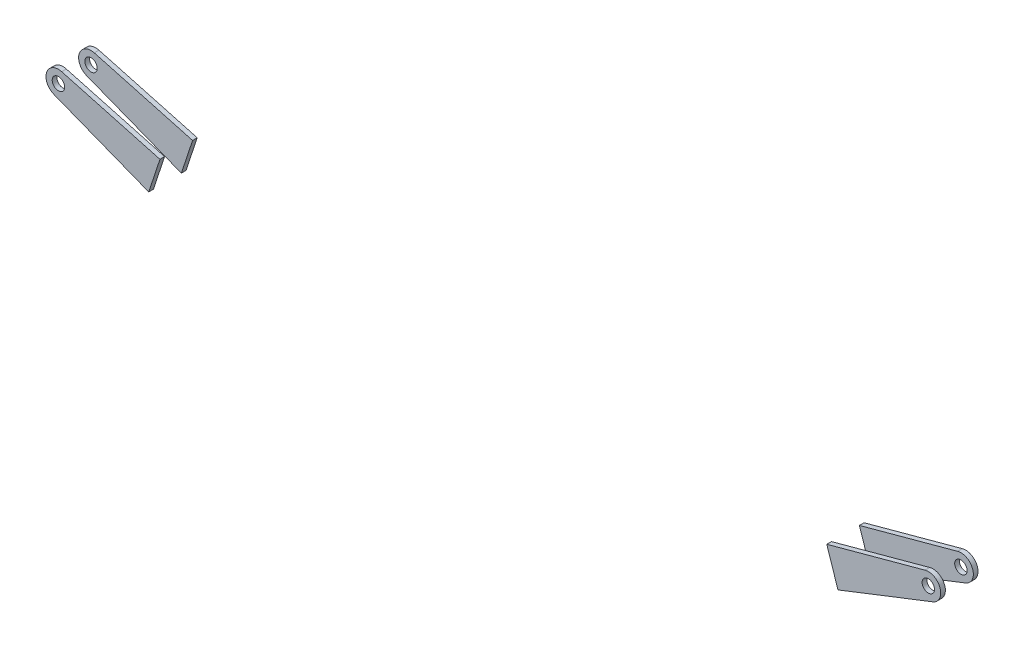
ISO-10303-21;
HEADER;
FILE_DESCRIPTION(('STEP AP214'),'2;1');
FILE_NAME('part.step','',(''),(''),'','','');
FILE_SCHEMA(('AUTOMOTIVE_DESIGN { 1 0 10303 214 1 1 1 1 }'));
ENDSEC;
DATA;
#1=APPLICATION_CONTEXT('core data for automotive mechanical design processes');
#2=APPLICATION_PROTOCOL_DEFINITION('international standard','automotive_design',2000,#1);
#3=PRODUCT_CONTEXT('',#1,'mechanical');
#4=PRODUCT('Part','Part','',(#3));
#5=PRODUCT_RELATED_PRODUCT_CATEGORY('part','',(#4));
#6=PRODUCT_DEFINITION_FORMATION('','',#4);
#7=PRODUCT_DEFINITION_CONTEXT('part definition',#1,'design');
#8=PRODUCT_DEFINITION('design','',#6,#7);
#9=PRODUCT_DEFINITION_SHAPE('','',#8);
#10=(LENGTH_UNIT() NAMED_UNIT(*) SI_UNIT(.MILLI.,.METRE.));
#11=(NAMED_UNIT(*) PLANE_ANGLE_UNIT() SI_UNIT($,.RADIAN.));
#12=(NAMED_UNIT(*) SI_UNIT($,.STERADIAN.) SOLID_ANGLE_UNIT());
#13=UNCERTAINTY_MEASURE_WITH_UNIT(LENGTH_MEASURE(1.E-05),#10,'distance_accuracy_value','');
#14=(GEOMETRIC_REPRESENTATION_CONTEXT(3) GLOBAL_UNCERTAINTY_ASSIGNED_CONTEXT((#13)) GLOBAL_UNIT_ASSIGNED_CONTEXT((#10,
#11,#12)) REPRESENTATION_CONTEXT('',''));
#15=CARTESIAN_POINT('',(0.,0.,0.));
#16=DIRECTION('',(0.,0.,1.));
#17=DIRECTION('',(1.,0.,0.));
#18=AXIS2_PLACEMENT_3D('',#15,#16,#17);
#19=CARTESIAN_POINT('',(0.,-3.14662974701436E-13,258.999999999998));
#20=DIRECTION('',(0.,0.,1.));
#21=DIRECTION('',(1.,0.,0.));
#22=AXIS2_PLACEMENT_3D('',#19,#20,#21);
#23=PLANE('',#22);
#24=CARTESIAN_POINT('',(-280.,-2230.,259.000000000058));
#25=DIRECTION('',(0.,0.,-1.));
#26=DIRECTION('',(-1.,0.,0.));
#27=AXIS2_PLACEMENT_3D('',#24,#25,#26);
#28=CIRCLE('',#27,3.99999999999999);
#29=CARTESIAN_POINT('',(-284.,-2230.,259.000000000058));
#30=VERTEX_POINT('',#29);
#31=EDGE_CURVE('E144',#30,#30,#28,.T.);
#32=ORIENTED_EDGE('',*,*,#31,.F.);
#33=EDGE_LOOP('',(#32));
#34=FACE_BOUND('',#33,.T.);
#35=CARTESIAN_POINT('',(-280.,-2230.,259.000000000058));
#36=DIRECTION('',(0.,0.,-1.));
#37=DIRECTION('',(-1.,0.,0.));
#38=AXIS2_PLACEMENT_3D('',#35,#36,#37);
#39=CIRCLE('',#38,7.9999999999999);
#40=CARTESIAN_POINT('',(-282.91256968066,-2237.45096892057,259.000000000058));
#41=VERTEX_POINT('',#40);
#42=CARTESIAN_POINT('',(-277.901209765393,-2222.28021505798,259.000000000058));
#43=VERTEX_POINT('',#42);
#44=EDGE_CURVE('E134',#41,#43,#39,.T.);
#45=ORIENTED_EDGE('',*,*,#44,.T.);
#46=DIRECTION('',(-0.964973117753147,0.262348779325866,0.));
#47=VECTOR('',#46,1.);
#48=CARTESIAN_POINT('',(-214.641037089507,-2239.47885901617,259.000000000058));
#49=LINE('',#48,#47);
#50=CARTESIAN_POINT('',(-214.641037089507,-2239.47885901617,259.000000000058));
#51=VERTEX_POINT('',#50);
#52=EDGE_CURVE('E164',#51,#43,#49,.T.);
#53=ORIENTED_EDGE('',*,*,#52,.F.);
#54=DIRECTION('',(0.313660285067586,0.949535268208254,0.));
#55=VECTOR('',#54,1.);
#56=CARTESIAN_POINT('',(-221.855223646063,-2261.31817018496,259.000000000059));
#57=LINE('',#56,#55);
#58=CARTESIAN_POINT('',(-221.855223646063,-2261.31817018496,259.000000000059));
#59=VERTEX_POINT('',#58);
#60=EDGE_CURVE('E140',#59,#51,#57,.T.);
#61=ORIENTED_EDGE('',*,*,#60,.F.);
#62=DIRECTION('',(0.931371115071232,-0.364071210082547,0.));
#63=VECTOR('',#62,1.);
#64=CARTESIAN_POINT('',(-282.91256968066,-2237.45096892057,259.000000000058));
#65=LINE('',#64,#63);
#66=EDGE_CURVE('E96',#41,#59,#65,.T.);
#67=ORIENTED_EDGE('',*,*,#66,.F.);
#68=EDGE_LOOP('',(#45,#53,#61,#67));
#69=FACE_BOUND('',#68,.T.);
#70=ADVANCED_FACE('F87',(#34,#69),#23,.F.);
#71=CARTESIAN_POINT('',(0.,-2.35997231026075E-13,261.999999999998));
#72=DIRECTION('',(0.,0.,1.));
#73=DIRECTION('',(1.,0.,0.));
#74=AXIS2_PLACEMENT_3D('',#71,#72,#73);
#75=PLANE('',#74);
#76=CARTESIAN_POINT('',(-280.,-2230.,262.000000000058));
#77=DIRECTION('',(0.,0.,-1.));
#78=DIRECTION('',(-1.,0.,0.));
#79=AXIS2_PLACEMENT_3D('',#76,#77,#78);
#80=CIRCLE('',#79,3.99999999999999);
#81=CARTESIAN_POINT('',(-284.,-2230.,262.000000000058));
#82=VERTEX_POINT('',#81);
#83=EDGE_CURVE('E147',#82,#82,#80,.T.);
#84=ORIENTED_EDGE('',*,*,#83,.T.);
#85=EDGE_LOOP('',(#84));
#86=FACE_BOUND('',#85,.T.);
#87=CARTESIAN_POINT('',(-280.,-2230.,262.000000000058));
#88=DIRECTION('',(0.,0.,-1.));
#89=DIRECTION('',(-1.,0.,0.));
#90=AXIS2_PLACEMENT_3D('',#87,#88,#89);
#91=CIRCLE('',#90,7.9999999999999);
#92=CARTESIAN_POINT('',(-282.91256968066,-2237.45096892057,262.000000000058));
#93=VERTEX_POINT('',#92);
#94=CARTESIAN_POINT('',(-277.901209765393,-2222.28021505798,262.000000000058));
#95=VERTEX_POINT('',#94);
#96=EDGE_CURVE('E133',#93,#95,#91,.T.);
#97=ORIENTED_EDGE('',*,*,#96,.F.);
#98=DIRECTION('',(0.931371115071232,-0.364071210082547,0.));
#99=VECTOR('',#98,1.);
#100=CARTESIAN_POINT('',(-282.91256968066,-2237.45096892057,262.000000000058));
#101=LINE('',#100,#99);
#102=CARTESIAN_POINT('',(-221.855223646063,-2261.31817018496,262.000000000059));
#103=VERTEX_POINT('',#102);
#104=EDGE_CURVE('E13',#93,#103,#101,.T.);
#105=ORIENTED_EDGE('',*,*,#104,.T.);
#106=DIRECTION('',(0.313660285067586,0.949535268208254,0.));
#107=VECTOR('',#106,1.);
#108=CARTESIAN_POINT('',(-221.855223646063,-2261.31817018496,262.000000000059));
#109=LINE('',#108,#107);
#110=CARTESIAN_POINT('',(-214.641037089507,-2239.47885901617,262.000000000058));
#111=VERTEX_POINT('',#110);
#112=EDGE_CURVE('E141',#103,#111,#109,.T.);
#113=ORIENTED_EDGE('',*,*,#112,.T.);
#114=DIRECTION('',(-0.964973117753147,0.262348779325866,0.));
#115=VECTOR('',#114,1.);
#116=CARTESIAN_POINT('',(-214.641037089507,-2239.47885901617,262.000000000058));
#117=LINE('',#116,#115);
#118=EDGE_CURVE('E155',#111,#95,#117,.T.);
#119=ORIENTED_EDGE('',*,*,#118,.T.);
#120=EDGE_LOOP('',(#97,#105,#113,#119));
#121=FACE_BOUND('',#120,.T.);
#122=ADVANCED_FACE('F185',(#86,#121),#75,.T.);
#123=CARTESIAN_POINT('',(-280.,-2230.,262.000000000058));
#124=DIRECTION('',(0.,0.,-1.));
#125=DIRECTION('',(-1.,0.,0.));
#126=AXIS2_PLACEMENT_3D('',#123,#124,#125);
#127=CYLINDRICAL_SURFACE('',#126,7.9999999999999);
#128=ORIENTED_EDGE('',*,*,#44,.F.);
#129=DIRECTION('',(0.,0.,-1.));
#130=VECTOR('',#129,1.);
#131=CARTESIAN_POINT('',(-282.91256968066,-2237.45096892057,262.000000000058));
#132=LINE('',#131,#130);
#133=EDGE_CURVE('E128',#93,#41,#132,.T.);
#134=ORIENTED_EDGE('',*,*,#133,.F.);
#135=ORIENTED_EDGE('',*,*,#96,.T.);
#136=DIRECTION('',(0.,0.,-1.));
#137=VECTOR('',#136,1.);
#138=CARTESIAN_POINT('',(-277.901209765393,-2222.28021505798,262.000000000058));
#139=LINE('',#138,#137);
#140=EDGE_CURVE('E125',#95,#43,#139,.T.);
#141=ORIENTED_EDGE('',*,*,#140,.T.);
#142=EDGE_LOOP('',(#128,#134,#135,#141));
#143=FACE_BOUND('',#142,.T.);
#144=ADVANCED_FACE('F143',(#143),#127,.T.);
#145=CARTESIAN_POINT('',(-282.91256968066,-2237.45096892057,262.000000000058));
#146=DIRECTION('',(0.364071210082547,0.931371115071232,0.));
#147=DIRECTION('',(0.931371115071232,-0.364071210082547,0.));
#148=AXIS2_PLACEMENT_3D('',#145,#146,#147);
#149=PLANE('',#148);
#150=ORIENTED_EDGE('',*,*,#66,.T.);
#151=DIRECTION('',(0.,0.,-1.));
#152=VECTOR('',#151,1.);
#153=CARTESIAN_POINT('',(-221.855223646063,-2261.31817018496,262.000000000059));
#154=LINE('',#153,#152);
#155=EDGE_CURVE('E105',#103,#59,#154,.T.);
#156=ORIENTED_EDGE('',*,*,#155,.F.);
#157=ORIENTED_EDGE('',*,*,#104,.F.);
#158=ORIENTED_EDGE('',*,*,#133,.T.);
#159=EDGE_LOOP('',(#150,#156,#157,#158));
#160=FACE_BOUND('',#159,.T.);
#161=ADVANCED_FACE('F130',(#160),#149,.F.);
#162=CARTESIAN_POINT('',(-221.855223646063,-2261.31817018496,262.000000000059));
#163=DIRECTION('',(-0.949535268208254,0.313660285067586,0.));
#164=DIRECTION('',(0.313660285067586,0.949535268208254,0.));
#165=AXIS2_PLACEMENT_3D('',#162,#163,#164);
#166=PLANE('',#165);
#167=ORIENTED_EDGE('',*,*,#60,.T.);
#168=DIRECTION('',(0.,0.,-1.));
#169=VECTOR('',#168,1.);
#170=CARTESIAN_POINT('',(-214.641037089507,-2239.47885901617,262.000000000058));
#171=LINE('',#170,#169);
#172=EDGE_CURVE('E160',#111,#51,#171,.T.);
#173=ORIENTED_EDGE('',*,*,#172,.F.);
#174=ORIENTED_EDGE('',*,*,#112,.F.);
#175=ORIENTED_EDGE('',*,*,#155,.T.);
#176=EDGE_LOOP('',(#167,#173,#174,#175));
#177=FACE_BOUND('',#176,.T.);
#178=ADVANCED_FACE('F182',(#177),#166,.F.);
#179=CARTESIAN_POINT('',(-214.641037089507,-2239.47885901617,262.000000000058));
#180=DIRECTION('',(-0.262348779325866,-0.964973117753147,0.));
#181=DIRECTION('',(-0.964973117753147,0.262348779325866,0.));
#182=AXIS2_PLACEMENT_3D('',#179,#180,#181);
#183=PLANE('',#182);
#184=ORIENTED_EDGE('',*,*,#52,.T.);
#185=ORIENTED_EDGE('',*,*,#140,.F.);
#186=ORIENTED_EDGE('',*,*,#118,.F.);
#187=ORIENTED_EDGE('',*,*,#172,.T.);
#188=EDGE_LOOP('',(#184,#185,#186,#187));
#189=FACE_BOUND('',#188,.T.);
#190=ADVANCED_FACE('F187',(#189),#183,.F.);
#191=CARTESIAN_POINT('',(-280.,-2230.,262.000000000058));
#192=DIRECTION('',(0.,0.,-1.));
#193=DIRECTION('',(-1.,0.,0.));
#194=AXIS2_PLACEMENT_3D('',#191,#192,#193);
#195=CYLINDRICAL_SURFACE('',#194,3.99999999999999);
#196=ORIENTED_EDGE('',*,*,#83,.F.);
#197=EDGE_LOOP('',(#196));
#198=FACE_BOUND('',#197,.T.);
#199=ORIENTED_EDGE('',*,*,#31,.T.);
#200=EDGE_LOOP('',(#199));
#201=FACE_BOUND('',#200,.T.);
#202=ADVANCED_FACE('F189',(#198,#201),#195,.F.);
#203=CLOSED_SHELL('',(#70,#122,#144,#161,#178,#190,#202));
#204=MANIFOLD_SOLID_BREP('B2',#203);
#205=CARTESIAN_POINT('',(0.,0.,282.999999999997));
#206=DIRECTION('',(0.,0.,-1.));
#207=DIRECTION('',(1.,0.,0.));
#208=AXIS2_PLACEMENT_3D('',#205,#206,#207);
#209=PLANE('',#208);
#210=CARTESIAN_POINT('',(-280.,-2230.,282.999999999998));
#211=DIRECTION('',(0.,0.,-1.));
#212=DIRECTION('',(-1.,0.,0.));
#213=AXIS2_PLACEMENT_3D('',#210,#211,#212);
#214=CIRCLE('',#213,3.99999999999999);
#215=CARTESIAN_POINT('',(-284.,-2230.,282.999999999998));
#216=VERTEX_POINT('',#215);
#217=EDGE_CURVE('E325',#216,#216,#214,.T.);
#218=ORIENTED_EDGE('',*,*,#217,.T.);
#219=EDGE_LOOP('',(#218));
#220=FACE_BOUND('',#219,.T.);
#221=CARTESIAN_POINT('',(-280.,-2230.,282.999999999998));
#222=DIRECTION('',(0.,0.,-1.));
#223=DIRECTION('',(-1.,0.,0.));
#224=AXIS2_PLACEMENT_3D('',#221,#222,#223);
#225=CIRCLE('',#224,7.9999999999999);
#226=CARTESIAN_POINT('',(-282.91256968066,-2237.45096892057,282.999999999998));
#227=VERTEX_POINT('',#226);
#228=CARTESIAN_POINT('',(-277.901209765393,-2222.28021505798,282.999999999998));
#229=VERTEX_POINT('',#228);
#230=EDGE_CURVE('E312',#227,#229,#225,.T.);
#231=ORIENTED_EDGE('',*,*,#230,.F.);
#232=DIRECTION('',(0.931371115071232,-0.364071210082547,0.));
#233=VECTOR('',#232,1.);
#234=CARTESIAN_POINT('',(-282.91256968066,-2237.45096892057,282.999999999998));
#235=LINE('',#234,#233);
#236=CARTESIAN_POINT('',(-221.855223646063,-2261.31817018496,282.999999999998));
#237=VERTEX_POINT('',#236);
#238=EDGE_CURVE('E274',#227,#237,#235,.T.);
#239=ORIENTED_EDGE('',*,*,#238,.T.);
#240=DIRECTION('',(0.313660285067586,0.949535268208254,0.));
#241=VECTOR('',#240,1.);
#242=CARTESIAN_POINT('',(-221.855223646063,-2261.31817018496,282.999999999998));
#243=LINE('',#242,#241);
#244=CARTESIAN_POINT('',(-214.641037089507,-2239.47885901617,282.999999999998));
#245=VERTEX_POINT('',#244);
#246=EDGE_CURVE('E335',#237,#245,#243,.T.);
#247=ORIENTED_EDGE('',*,*,#246,.T.);
#248=DIRECTION('',(-0.964973117753147,0.262348779325866,0.));
#249=VECTOR('',#248,1.);
#250=CARTESIAN_POINT('',(-214.641037089507,-2239.47885901617,282.999999999998));
#251=LINE('',#250,#249);
#252=EDGE_CURVE('E324',#245,#229,#251,.T.);
#253=ORIENTED_EDGE('',*,*,#252,.T.);
#254=EDGE_LOOP('',(#231,#239,#247,#253));
#255=FACE_BOUND('',#254,.T.);
#256=ADVANCED_FACE('F265',(#220,#255),#209,.F.);
#257=CARTESIAN_POINT('',(0.,0.,279.999999999997));
#258=DIRECTION('',(0.,0.,-1.));
#259=DIRECTION('',(1.,0.,0.));
#260=AXIS2_PLACEMENT_3D('',#257,#258,#259);
#261=PLANE('',#260);
#262=CARTESIAN_POINT('',(-280.,-2230.,279.999999999998));
#263=DIRECTION('',(0.,0.,-1.));
#264=DIRECTION('',(-1.,0.,0.));
#265=AXIS2_PLACEMENT_3D('',#262,#263,#264);
#266=CIRCLE('',#265,3.99999999999999);
#267=CARTESIAN_POINT('',(-284.,-2230.,279.999999999998));
#268=VERTEX_POINT('',#267);
#269=EDGE_CURVE('E328',#268,#268,#266,.T.);
#270=ORIENTED_EDGE('',*,*,#269,.F.);
#271=EDGE_LOOP('',(#270));
#272=FACE_BOUND('',#271,.T.);
#273=CARTESIAN_POINT('',(-280.,-2230.,279.999999999998));
#274=DIRECTION('',(0.,0.,-1.));
#275=DIRECTION('',(-1.,0.,0.));
#276=AXIS2_PLACEMENT_3D('',#273,#274,#275);
#277=CIRCLE('',#276,7.9999999999999);
#278=CARTESIAN_POINT('',(-282.91256968066,-2237.45096892057,279.999999999998));
#279=VERTEX_POINT('',#278);
#280=CARTESIAN_POINT('',(-277.901209765393,-2222.28021505798,279.999999999998));
#281=VERTEX_POINT('',#280);
#282=EDGE_CURVE('E314',#279,#281,#277,.T.);
#283=ORIENTED_EDGE('',*,*,#282,.T.);
#284=DIRECTION('',(-0.964973117753147,0.262348779325866,0.));
#285=VECTOR('',#284,1.);
#286=CARTESIAN_POINT('',(-214.641037089507,-2239.47885901617,279.999999999998));
#287=LINE('',#286,#285);
#288=CARTESIAN_POINT('',(-214.641037089507,-2239.47885901617,279.999999999998));
#289=VERTEX_POINT('',#288);
#290=EDGE_CURVE('E337',#289,#281,#287,.T.);
#291=ORIENTED_EDGE('',*,*,#290,.F.);
#292=DIRECTION('',(0.313660285067586,0.949535268208254,0.));
#293=VECTOR('',#292,1.);
#294=CARTESIAN_POINT('',(-221.855223646063,-2261.31817018496,279.999999999998));
#295=LINE('',#294,#293);
#296=CARTESIAN_POINT('',(-221.855223646063,-2261.31817018496,279.999999999998));
#297=VERTEX_POINT('',#296);
#298=EDGE_CURVE('E322',#297,#289,#295,.T.);
#299=ORIENTED_EDGE('',*,*,#298,.F.);
#300=DIRECTION('',(0.931371115071232,-0.364071210082547,0.));
#301=VECTOR('',#300,1.);
#302=CARTESIAN_POINT('',(-282.91256968066,-2237.45096892057,279.999999999998));
#303=LINE('',#302,#301);
#304=EDGE_CURVE('E85',#279,#297,#303,.T.);
#305=ORIENTED_EDGE('',*,*,#304,.F.);
#306=EDGE_LOOP('',(#283,#291,#299,#305));
#307=FACE_BOUND('',#306,.T.);
#308=ADVANCED_FACE('F364',(#272,#307),#261,.T.);
#309=CARTESIAN_POINT('',(-280.,-2230.,279.999999999998));
#310=DIRECTION('',(0.,0.,1.));
#311=DIRECTION('',(-1.,0.,0.));
#312=AXIS2_PLACEMENT_3D('',#309,#310,#311);
#313=CYLINDRICAL_SURFACE('',#312,7.9999999999999);
#314=ORIENTED_EDGE('',*,*,#230,.T.);
#315=DIRECTION('',(0.,0.,1.));
#316=VECTOR('',#315,1.);
#317=CARTESIAN_POINT('',(-277.901209765393,-2222.28021505798,279.999999999998));
#318=LINE('',#317,#316);
#319=EDGE_CURVE('E302',#281,#229,#318,.T.);
#320=ORIENTED_EDGE('',*,*,#319,.F.);
#321=ORIENTED_EDGE('',*,*,#282,.F.);
#322=DIRECTION('',(0.,0.,1.));
#323=VECTOR('',#322,1.);
#324=CARTESIAN_POINT('',(-282.91256968066,-2237.45096892057,279.999999999998));
#325=LINE('',#324,#323);
#326=EDGE_CURVE('E308',#279,#227,#325,.T.);
#327=ORIENTED_EDGE('',*,*,#326,.T.);
#328=EDGE_LOOP('',(#314,#320,#321,#327));
#329=FACE_BOUND('',#328,.T.);
#330=ADVANCED_FACE('F310',(#329),#313,.T.);
#331=CARTESIAN_POINT('',(-282.91256968066,-2237.45096892057,279.999999999998));
#332=DIRECTION('',(0.364071210082547,0.931371115071232,0.));
#333=DIRECTION('',(0.931371115071232,-0.364071210082547,0.));
#334=AXIS2_PLACEMENT_3D('',#331,#332,#333);
#335=PLANE('',#334);
#336=ORIENTED_EDGE('',*,*,#238,.F.);
#337=ORIENTED_EDGE('',*,*,#326,.F.);
#338=ORIENTED_EDGE('',*,*,#304,.T.);
#339=DIRECTION('',(0.,0.,1.));
#340=VECTOR('',#339,1.);
#341=CARTESIAN_POINT('',(-221.855223646063,-2261.31817018496,279.999999999998));
#342=LINE('',#341,#340);
#343=EDGE_CURVE('E283',#297,#237,#342,.T.);
#344=ORIENTED_EDGE('',*,*,#343,.T.);
#345=EDGE_LOOP('',(#336,#337,#338,#344));
#346=FACE_BOUND('',#345,.T.);
#347=ADVANCED_FACE('F319',(#346),#335,.F.);
#348=CARTESIAN_POINT('',(-221.855223646063,-2261.31817018496,279.999999999998));
#349=DIRECTION('',(-0.949535268208254,0.313660285067586,0.));
#350=DIRECTION('',(0.313660285067586,0.949535268208254,0.));
#351=AXIS2_PLACEMENT_3D('',#348,#349,#350);
#352=PLANE('',#351);
#353=ORIENTED_EDGE('',*,*,#246,.F.);
#354=ORIENTED_EDGE('',*,*,#343,.F.);
#355=ORIENTED_EDGE('',*,*,#298,.T.);
#356=DIRECTION('',(0.,0.,1.));
#357=VECTOR('',#356,1.);
#358=CARTESIAN_POINT('',(-214.641037089507,-2239.47885901617,279.999999999998));
#359=LINE('',#358,#357);
#360=EDGE_CURVE('E341',#289,#245,#359,.T.);
#361=ORIENTED_EDGE('',*,*,#360,.T.);
#362=EDGE_LOOP('',(#353,#354,#355,#361));
#363=FACE_BOUND('',#362,.T.);
#364=ADVANCED_FACE('F363',(#363),#352,.F.);
#365=CARTESIAN_POINT('',(-214.641037089507,-2239.47885901617,279.999999999998));
#366=DIRECTION('',(-0.262348779325866,-0.964973117753147,0.));
#367=DIRECTION('',(-0.964973117753147,0.262348779325866,0.));
#368=AXIS2_PLACEMENT_3D('',#365,#366,#367);
#369=PLANE('',#368);
#370=ORIENTED_EDGE('',*,*,#252,.F.);
#371=ORIENTED_EDGE('',*,*,#360,.F.);
#372=ORIENTED_EDGE('',*,*,#290,.T.);
#373=ORIENTED_EDGE('',*,*,#319,.T.);
#374=EDGE_LOOP('',(#370,#371,#372,#373));
#375=FACE_BOUND('',#374,.T.);
#376=ADVANCED_FACE('F365',(#375),#369,.F.);
#377=CARTESIAN_POINT('',(-280.,-2230.,279.999999999998));
#378=DIRECTION('',(0.,0.,1.));
#379=DIRECTION('',(-1.,0.,0.));
#380=AXIS2_PLACEMENT_3D('',#377,#378,#379);
#381=CYLINDRICAL_SURFACE('',#380,3.99999999999999);
#382=ORIENTED_EDGE('',*,*,#269,.T.);
#383=EDGE_LOOP('',(#382));
#384=FACE_BOUND('',#383,.T.);
#385=ORIENTED_EDGE('',*,*,#217,.F.);
#386=EDGE_LOOP('',(#385));
#387=FACE_BOUND('',#386,.T.);
#388=ADVANCED_FACE('F367',(#384,#387),#381,.F.);
#389=CLOSED_SHELL('',(#256,#308,#330,#347,#364,#376,#388));
#390=MANIFOLD_SOLID_BREP('B7',#389);
#391=CARTESIAN_POINT('',(0.,-3.14662974701436E-13,258.999999999998));
#392=DIRECTION('',(0.,0.,1.));
#393=DIRECTION('',(-1.,0.,0.));
#394=AXIS2_PLACEMENT_3D('',#391,#392,#393);
#395=PLANE('',#394);
#396=CARTESIAN_POINT('',(280.,-2230.,259.000000000058));
#397=DIRECTION('',(0.,0.,1.));
#398=DIRECTION('',(1.,0.,0.));
#399=AXIS2_PLACEMENT_3D('',#396,#397,#398);
#400=CIRCLE('',#399,3.99999999999999);
#401=CARTESIAN_POINT('',(284.,-2230.,259.000000000058));
#402=VERTEX_POINT('',#401);
#403=EDGE_CURVE('E502',#402,#402,#400,.T.);
#404=ORIENTED_EDGE('',*,*,#403,.T.);
#405=EDGE_LOOP('',(#404));
#406=FACE_BOUND('',#405,.T.);
#407=CARTESIAN_POINT('',(280.,-2230.,259.000000000058));
#408=DIRECTION('',(0.,0.,1.));
#409=DIRECTION('',(1.,0.,0.));
#410=AXIS2_PLACEMENT_3D('',#407,#408,#409);
#411=CIRCLE('',#410,7.9999999999999);
#412=CARTESIAN_POINT('',(282.91256968066,-2237.45096892057,259.000000000058));
#413=VERTEX_POINT('',#412);
#414=CARTESIAN_POINT('',(277.901209765393,-2222.28021505798,259.000000000058));
#415=VERTEX_POINT('',#414);
#416=EDGE_CURVE('E489',#413,#415,#411,.T.);
#417=ORIENTED_EDGE('',*,*,#416,.F.);
#418=DIRECTION('',(-0.931371115071232,-0.364071210082547,0.));
#419=VECTOR('',#418,1.);
#420=CARTESIAN_POINT('',(282.91256968066,-2237.45096892057,259.000000000058));
#421=LINE('',#420,#419);
#422=CARTESIAN_POINT('',(221.855223646063,-2261.31817018496,259.000000000059));
#423=VERTEX_POINT('',#422);
#424=EDGE_CURVE('E451',#413,#423,#421,.T.);
#425=ORIENTED_EDGE('',*,*,#424,.T.);
#426=DIRECTION('',(-0.313660285067586,0.949535268208254,0.));
#427=VECTOR('',#426,1.);
#428=CARTESIAN_POINT('',(221.855223646063,-2261.31817018496,259.000000000059));
#429=LINE('',#428,#427);
#430=CARTESIAN_POINT('',(214.641037089507,-2239.47885901617,259.000000000058));
#431=VERTEX_POINT('',#430);
#432=EDGE_CURVE('E512',#423,#431,#429,.T.);
#433=ORIENTED_EDGE('',*,*,#432,.T.);
#434=DIRECTION('',(0.964973117753147,0.262348779325866,0.));
#435=VECTOR('',#434,1.);
#436=CARTESIAN_POINT('',(214.641037089507,-2239.47885901617,259.000000000058));
#437=LINE('',#436,#435);
#438=EDGE_CURVE('E501',#431,#415,#437,.T.);
#439=ORIENTED_EDGE('',*,*,#438,.T.);
#440=EDGE_LOOP('',(#417,#425,#433,#439));
#441=FACE_BOUND('',#440,.T.);
#442=ADVANCED_FACE('F442',(#406,#441),#395,.F.);
#443=CARTESIAN_POINT('',(0.,-2.35997231026075E-13,261.999999999998));
#444=DIRECTION('',(0.,0.,1.));
#445=DIRECTION('',(-1.,0.,0.));
#446=AXIS2_PLACEMENT_3D('',#443,#444,#445);
#447=PLANE('',#446);
#448=CARTESIAN_POINT('',(280.,-2230.,262.000000000058));
#449=DIRECTION('',(0.,0.,1.));
#450=DIRECTION('',(1.,0.,0.));
#451=AXIS2_PLACEMENT_3D('',#448,#449,#450);
#452=CIRCLE('',#451,3.99999999999999);
#453=CARTESIAN_POINT('',(284.,-2230.,262.000000000058));
#454=VERTEX_POINT('',#453);
#455=EDGE_CURVE('E505',#454,#454,#452,.T.);
#456=ORIENTED_EDGE('',*,*,#455,.F.);
#457=EDGE_LOOP('',(#456));
#458=FACE_BOUND('',#457,.T.);
#459=CARTESIAN_POINT('',(280.,-2230.,262.000000000058));
#460=DIRECTION('',(0.,0.,1.));
#461=DIRECTION('',(1.,0.,0.));
#462=AXIS2_PLACEMENT_3D('',#459,#460,#461);
#463=CIRCLE('',#462,7.9999999999999);
#464=CARTESIAN_POINT('',(282.91256968066,-2237.45096892057,262.000000000058));
#465=VERTEX_POINT('',#464);
#466=CARTESIAN_POINT('',(277.901209765393,-2222.28021505798,262.000000000058));
#467=VERTEX_POINT('',#466);
#468=EDGE_CURVE('E491',#465,#467,#463,.T.);
#469=ORIENTED_EDGE('',*,*,#468,.T.);
#470=DIRECTION('',(0.964973117753147,0.262348779325866,0.));
#471=VECTOR('',#470,1.);
#472=CARTESIAN_POINT('',(214.641037089507,-2239.47885901617,262.000000000058));
#473=LINE('',#472,#471);
#474=CARTESIAN_POINT('',(214.641037089507,-2239.47885901617,262.000000000058));
#475=VERTEX_POINT('',#474);
#476=EDGE_CURVE('E514',#475,#467,#473,.T.);
#477=ORIENTED_EDGE('',*,*,#476,.F.);
#478=DIRECTION('',(-0.313660285067586,0.949535268208254,0.));
#479=VECTOR('',#478,1.);
#480=CARTESIAN_POINT('',(221.855223646063,-2261.31817018496,262.000000000059));
#481=LINE('',#480,#479);
#482=CARTESIAN_POINT('',(221.855223646063,-2261.31817018496,262.000000000059));
#483=VERTEX_POINT('',#482);
#484=EDGE_CURVE('E499',#483,#475,#481,.T.);
#485=ORIENTED_EDGE('',*,*,#484,.F.);
#486=DIRECTION('',(-0.931371115071232,-0.364071210082547,0.));
#487=VECTOR('',#486,1.);
#488=CARTESIAN_POINT('',(282.91256968066,-2237.45096892057,262.000000000058));
#489=LINE('',#488,#487);
#490=EDGE_CURVE('E263',#465,#483,#489,.T.);
#491=ORIENTED_EDGE('',*,*,#490,.F.);
#492=EDGE_LOOP('',(#469,#477,#485,#491));
#493=FACE_BOUND('',#492,.T.);
#494=ADVANCED_FACE('F541',(#458,#493),#447,.T.);
#495=CARTESIAN_POINT('',(280.,-2230.,262.000000000058));
#496=DIRECTION('',(0.,0.,-1.));
#497=DIRECTION('',(1.,0.,0.));
#498=AXIS2_PLACEMENT_3D('',#495,#496,#497);
#499=CYLINDRICAL_SURFACE('',#498,7.9999999999999);
#500=ORIENTED_EDGE('',*,*,#416,.T.);
#501=DIRECTION('',(0.,0.,-1.));
#502=VECTOR('',#501,1.);
#503=CARTESIAN_POINT('',(277.901209765393,-2222.28021505798,262.000000000058));
#504=LINE('',#503,#502);
#505=EDGE_CURVE('E479',#467,#415,#504,.T.);
#506=ORIENTED_EDGE('',*,*,#505,.F.);
#507=ORIENTED_EDGE('',*,*,#468,.F.);
#508=DIRECTION('',(0.,0.,-1.));
#509=VECTOR('',#508,1.);
#510=CARTESIAN_POINT('',(282.91256968066,-2237.45096892057,262.000000000058));
#511=LINE('',#510,#509);
#512=EDGE_CURVE('E485',#465,#413,#511,.T.);
#513=ORIENTED_EDGE('',*,*,#512,.T.);
#514=EDGE_LOOP('',(#500,#506,#507,#513));
#515=FACE_BOUND('',#514,.T.);
#516=ADVANCED_FACE('F487',(#515),#499,.T.);
#517=CARTESIAN_POINT('',(282.91256968066,-2237.45096892057,262.000000000058));
#518=DIRECTION('',(-0.364071210082547,0.931371115071232,0.));
#519=DIRECTION('',(-0.931371115071232,-0.364071210082547,0.));
#520=AXIS2_PLACEMENT_3D('',#517,#518,#519);
#521=PLANE('',#520);
#522=ORIENTED_EDGE('',*,*,#424,.F.);
#523=ORIENTED_EDGE('',*,*,#512,.F.);
#524=ORIENTED_EDGE('',*,*,#490,.T.);
#525=DIRECTION('',(0.,0.,-1.));
#526=VECTOR('',#525,1.);
#527=CARTESIAN_POINT('',(221.855223646063,-2261.31817018496,262.000000000059));
#528=LINE('',#527,#526);
#529=EDGE_CURVE('E460',#483,#423,#528,.T.);
#530=ORIENTED_EDGE('',*,*,#529,.T.);
#531=EDGE_LOOP('',(#522,#523,#524,#530));
#532=FACE_BOUND('',#531,.T.);
#533=ADVANCED_FACE('F496',(#532),#521,.F.);
#534=CARTESIAN_POINT('',(221.855223646063,-2261.31817018496,262.000000000059));
#535=DIRECTION('',(0.949535268208254,0.313660285067586,0.));
#536=DIRECTION('',(-0.313660285067586,0.949535268208254,0.));
#537=AXIS2_PLACEMENT_3D('',#534,#535,#536);
#538=PLANE('',#537);
#539=ORIENTED_EDGE('',*,*,#432,.F.);
#540=ORIENTED_EDGE('',*,*,#529,.F.);
#541=ORIENTED_EDGE('',*,*,#484,.T.);
#542=DIRECTION('',(0.,0.,-1.));
#543=VECTOR('',#542,1.);
#544=CARTESIAN_POINT('',(214.641037089507,-2239.47885901617,262.000000000058));
#545=LINE('',#544,#543);
#546=EDGE_CURVE('E518',#475,#431,#545,.T.);
#547=ORIENTED_EDGE('',*,*,#546,.T.);
#548=EDGE_LOOP('',(#539,#540,#541,#547));
#549=FACE_BOUND('',#548,.T.);
#550=ADVANCED_FACE('F540',(#549),#538,.F.);
#551=CARTESIAN_POINT('',(214.641037089507,-2239.47885901617,262.000000000058));
#552=DIRECTION('',(0.262348779325866,-0.964973117753147,0.));
#553=DIRECTION('',(0.964973117753147,0.262348779325866,0.));
#554=AXIS2_PLACEMENT_3D('',#551,#552,#553);
#555=PLANE('',#554);
#556=ORIENTED_EDGE('',*,*,#438,.F.);
#557=ORIENTED_EDGE('',*,*,#546,.F.);
#558=ORIENTED_EDGE('',*,*,#476,.T.);
#559=ORIENTED_EDGE('',*,*,#505,.T.);
#560=EDGE_LOOP('',(#556,#557,#558,#559));
#561=FACE_BOUND('',#560,.T.);
#562=ADVANCED_FACE('F542',(#561),#555,.F.);
#563=CARTESIAN_POINT('',(280.,-2230.,262.000000000058));
#564=DIRECTION('',(0.,0.,-1.));
#565=DIRECTION('',(1.,0.,0.));
#566=AXIS2_PLACEMENT_3D('',#563,#564,#565);
#567=CYLINDRICAL_SURFACE('',#566,3.99999999999999);
#568=ORIENTED_EDGE('',*,*,#455,.T.);
#569=EDGE_LOOP('',(#568));
#570=FACE_BOUND('',#569,.T.);
#571=ORIENTED_EDGE('',*,*,#403,.F.);
#572=EDGE_LOOP('',(#571));
#573=FACE_BOUND('',#572,.T.);
#574=ADVANCED_FACE('F544',(#570,#573),#567,.F.);
#575=CLOSED_SHELL('',(#442,#494,#516,#533,#550,#562,#574));
#576=MANIFOLD_SOLID_BREP('B79',#575);
#577=CARTESIAN_POINT('',(0.,0.,282.999999999997));
#578=DIRECTION('',(0.,0.,-1.));
#579=DIRECTION('',(-1.,0.,0.));
#580=AXIS2_PLACEMENT_3D('',#577,#578,#579);
#581=PLANE('',#580);
#582=CARTESIAN_POINT('',(280.,-2230.,282.999999999998));
#583=DIRECTION('',(0.,0.,1.));
#584=DIRECTION('',(1.,0.,0.));
#585=AXIS2_PLACEMENT_3D('',#582,#583,#584);
#586=CIRCLE('',#585,3.99999999999999);
#587=CARTESIAN_POINT('',(284.,-2230.,282.999999999998));
#588=VERTEX_POINT('',#587);
#589=EDGE_CURVE('E667',#588,#588,#586,.T.);
#590=ORIENTED_EDGE('',*,*,#589,.F.);
#591=EDGE_LOOP('',(#590));
#592=FACE_BOUND('',#591,.T.);
#593=CARTESIAN_POINT('',(280.,-2230.,282.999999999998));
#594=DIRECTION('',(0.,0.,1.));
#595=DIRECTION('',(1.,0.,0.));
#596=AXIS2_PLACEMENT_3D('',#593,#594,#595);
#597=CIRCLE('',#596,7.9999999999999);
#598=CARTESIAN_POINT('',(282.91256968066,-2237.45096892057,282.999999999998));
#599=VERTEX_POINT('',#598);
#600=CARTESIAN_POINT('',(277.901209765393,-2222.28021505798,282.999999999998));
#601=VERTEX_POINT('',#600);
#602=EDGE_CURVE('E645',#599,#601,#597,.T.);
#603=ORIENTED_EDGE('',*,*,#602,.T.);
#604=DIRECTION('',(0.964973117753147,0.262348779325866,0.));
#605=VECTOR('',#604,1.);
#606=CARTESIAN_POINT('',(214.641037089507,-2239.47885901617,282.999999999998));
#607=LINE('',#606,#605);
#608=CARTESIAN_POINT('',(214.641037089507,-2239.47885901617,282.999999999998));
#609=VERTEX_POINT('',#608);
#610=EDGE_CURVE('E688',#609,#601,#607,.T.);
#611=ORIENTED_EDGE('',*,*,#610,.F.);
#612=DIRECTION('',(-0.313660285067586,0.949535268208254,0.));
#613=VECTOR('',#612,1.);
#614=CARTESIAN_POINT('',(221.855223646063,-2261.31817018496,282.999999999998));
#615=LINE('',#614,#613);
#616=CARTESIAN_POINT('',(221.855223646063,-2261.31817018496,282.999999999998));
#617=VERTEX_POINT('',#616);
#618=EDGE_CURVE('E650',#617,#609,#615,.T.);
#619=ORIENTED_EDGE('',*,*,#618,.F.);
#620=DIRECTION('',(-0.931371115071232,-0.364071210082547,0.));
#621=VECTOR('',#620,1.);
#622=CARTESIAN_POINT('',(282.91256968066,-2237.45096892057,282.999999999998));
#623=LINE('',#622,#621);
#624=EDGE_CURVE('E619',#599,#617,#623,.T.);
#625=ORIENTED_EDGE('',*,*,#624,.F.);
#626=EDGE_LOOP('',(#603,#611,#619,#625));
#627=FACE_BOUND('',#626,.T.);
#628=ADVANCED_FACE('F610',(#592,#627),#581,.F.);
#629=CARTESIAN_POINT('',(0.,0.,279.999999999997));
#630=DIRECTION('',(0.,0.,-1.));
#631=DIRECTION('',(-1.,0.,0.));
#632=AXIS2_PLACEMENT_3D('',#629,#630,#631);
#633=PLANE('',#632);
#634=CARTESIAN_POINT('',(280.,-2230.,279.999999999998));
#635=DIRECTION('',(0.,0.,1.));
#636=DIRECTION('',(1.,0.,0.));
#637=AXIS2_PLACEMENT_3D('',#634,#635,#636);
#638=CIRCLE('',#637,3.99999999999999);
#639=CARTESIAN_POINT('',(284.,-2230.,279.999999999998));
#640=VERTEX_POINT('',#639);
#641=EDGE_CURVE('E670',#640,#640,#638,.T.);
#642=ORIENTED_EDGE('',*,*,#641,.T.);
#643=EDGE_LOOP('',(#642));
#644=FACE_BOUND('',#643,.T.);
#645=CARTESIAN_POINT('',(280.,-2230.,279.999999999998));
#646=DIRECTION('',(0.,0.,1.));
#647=DIRECTION('',(1.,0.,0.));
#648=AXIS2_PLACEMENT_3D('',#645,#646,#647);
#649=CIRCLE('',#648,7.9999999999999);
#650=CARTESIAN_POINT('',(282.91256968066,-2237.45096892057,279.999999999998));
#651=VERTEX_POINT('',#650);
#652=CARTESIAN_POINT('',(277.901209765393,-2222.28021505798,279.999999999998));
#653=VERTEX_POINT('',#652);
#654=EDGE_CURVE('E661',#651,#653,#649,.T.);
#655=ORIENTED_EDGE('',*,*,#654,.F.);
#656=DIRECTION('',(-0.931371115071232,-0.364071210082547,0.));
#657=VECTOR('',#656,1.);
#658=CARTESIAN_POINT('',(282.91256968066,-2237.45096892057,279.999999999998));
#659=LINE('',#658,#657);
#660=CARTESIAN_POINT('',(221.855223646063,-2261.31817018496,279.999999999998));
#661=VERTEX_POINT('',#660);
#662=EDGE_CURVE('E440',#651,#661,#659,.T.);
#663=ORIENTED_EDGE('',*,*,#662,.T.);
#664=DIRECTION('',(-0.313660285067586,0.949535268208254,0.));
#665=VECTOR('',#664,1.);
#666=CARTESIAN_POINT('',(221.855223646063,-2261.31817018496,279.999999999998));
#667=LINE('',#666,#665);
#668=CARTESIAN_POINT('',(214.641037089507,-2239.47885901617,279.999999999998));
#669=VERTEX_POINT('',#668);
#670=EDGE_CURVE('E654',#661,#669,#667,.T.);
#671=ORIENTED_EDGE('',*,*,#670,.T.);
#672=DIRECTION('',(0.964973117753147,0.262348779325866,0.));
#673=VECTOR('',#672,1.);
#674=CARTESIAN_POINT('',(214.641037089507,-2239.47885901617,279.999999999998));
#675=LINE('',#674,#673);
#676=EDGE_CURVE('E679',#669,#653,#675,.T.);
#677=ORIENTED_EDGE('',*,*,#676,.T.);
#678=EDGE_LOOP('',(#655,#663,#671,#677));
#679=FACE_BOUND('',#678,.T.);
#680=ADVANCED_FACE('F708',(#644,#679),#633,.T.);
#681=CARTESIAN_POINT('',(280.,-2230.,279.999999999998));
#682=DIRECTION('',(0.,0.,1.));
#683=DIRECTION('',(1.,0.,0.));
#684=AXIS2_PLACEMENT_3D('',#681,#682,#683);
#685=CYLINDRICAL_SURFACE('',#684,7.9999999999999);
#686=ORIENTED_EDGE('',*,*,#602,.F.);
#687=DIRECTION('',(0.,0.,1.));
#688=VECTOR('',#687,1.);
#689=CARTESIAN_POINT('',(282.91256968066,-2237.45096892057,279.999999999998));
#690=LINE('',#689,#688);
#691=EDGE_CURVE('E657',#651,#599,#690,.T.);
#692=ORIENTED_EDGE('',*,*,#691,.F.);
#693=ORIENTED_EDGE('',*,*,#654,.T.);
#694=DIRECTION('',(0.,0.,1.));
#695=VECTOR('',#694,1.);
#696=CARTESIAN_POINT('',(277.901209765393,-2222.28021505798,279.999999999998));
#697=LINE('',#696,#695);
#698=EDGE_CURVE('E665',#653,#601,#697,.T.);
#699=ORIENTED_EDGE('',*,*,#698,.T.);
#700=EDGE_LOOP('',(#686,#692,#693,#699));
#701=FACE_BOUND('',#700,.T.);
#702=ADVANCED_FACE('F663',(#701),#685,.T.);
#703=CARTESIAN_POINT('',(282.91256968066,-2237.45096892057,279.999999999998));
#704=DIRECTION('',(-0.364071210082547,0.931371115071232,0.));
#705=DIRECTION('',(-0.931371115071232,-0.364071210082547,0.));
#706=AXIS2_PLACEMENT_3D('',#703,#704,#705);
#707=PLANE('',#706);
#708=ORIENTED_EDGE('',*,*,#624,.T.);
#709=DIRECTION('',(0.,0.,1.));
#710=VECTOR('',#709,1.);
#711=CARTESIAN_POINT('',(221.855223646063,-2261.31817018496,279.999999999998));
#712=LINE('',#711,#710);
#713=EDGE_CURVE('E678',#661,#617,#712,.T.);
#714=ORIENTED_EDGE('',*,*,#713,.F.);
#715=ORIENTED_EDGE('',*,*,#662,.F.);
#716=ORIENTED_EDGE('',*,*,#691,.T.);
#717=EDGE_LOOP('',(#708,#714,#715,#716));
#718=FACE_BOUND('',#717,.T.);
#719=ADVANCED_FACE('F658',(#718),#707,.F.);
#720=CARTESIAN_POINT('',(221.855223646063,-2261.31817018496,279.999999999998));
#721=DIRECTION('',(0.949535268208254,0.313660285067586,0.));
#722=DIRECTION('',(-0.313660285067586,0.949535268208254,0.));
#723=AXIS2_PLACEMENT_3D('',#720,#721,#722);
#724=PLANE('',#723);
#725=ORIENTED_EDGE('',*,*,#618,.T.);
#726=DIRECTION('',(0.,0.,1.));
#727=VECTOR('',#726,1.);
#728=CARTESIAN_POINT('',(214.641037089507,-2239.47885901617,279.999999999998));
#729=LINE('',#728,#727);
#730=EDGE_CURVE('E683',#669,#609,#729,.T.);
#731=ORIENTED_EDGE('',*,*,#730,.F.);
#732=ORIENTED_EDGE('',*,*,#670,.F.);
#733=ORIENTED_EDGE('',*,*,#713,.T.);
#734=EDGE_LOOP('',(#725,#731,#732,#733));
#735=FACE_BOUND('',#734,.T.);
#736=ADVANCED_FACE('F705',(#735),#724,.F.);
#737=CARTESIAN_POINT('',(214.641037089507,-2239.47885901617,279.999999999998));
#738=DIRECTION('',(0.262348779325866,-0.964973117753147,0.));
#739=DIRECTION('',(0.964973117753147,0.262348779325866,0.));
#740=AXIS2_PLACEMENT_3D('',#737,#738,#739);
#741=PLANE('',#740);
#742=ORIENTED_EDGE('',*,*,#610,.T.);
#743=ORIENTED_EDGE('',*,*,#698,.F.);
#744=ORIENTED_EDGE('',*,*,#676,.F.);
#745=ORIENTED_EDGE('',*,*,#730,.T.);
#746=EDGE_LOOP('',(#742,#743,#744,#745));
#747=FACE_BOUND('',#746,.T.);
#748=ADVANCED_FACE('F710',(#747),#741,.F.);
#749=CARTESIAN_POINT('',(280.,-2230.,279.999999999998));
#750=DIRECTION('',(0.,0.,1.));
#751=DIRECTION('',(1.,0.,0.));
#752=AXIS2_PLACEMENT_3D('',#749,#750,#751);
#753=CYLINDRICAL_SURFACE('',#752,3.99999999999999);
#754=ORIENTED_EDGE('',*,*,#641,.F.);
#755=EDGE_LOOP('',(#754));
#756=FACE_BOUND('',#755,.T.);
#757=ORIENTED_EDGE('',*,*,#589,.T.);
#758=EDGE_LOOP('',(#757));
#759=FACE_BOUND('',#758,.T.);
#760=ADVANCED_FACE('F712',(#756,#759),#753,.F.);
#761=CLOSED_SHELL('',(#628,#680,#702,#719,#736,#748,#760));
#762=MANIFOLD_SOLID_BREP('B257',#761);
#763=ADVANCED_BREP_SHAPE_REPRESENTATION('',(#18,#204,#390,#576,#762),#14);
#764=SHAPE_DEFINITION_REPRESENTATION(#9,#763);
ENDSEC;
END-ISO-10303-21;
